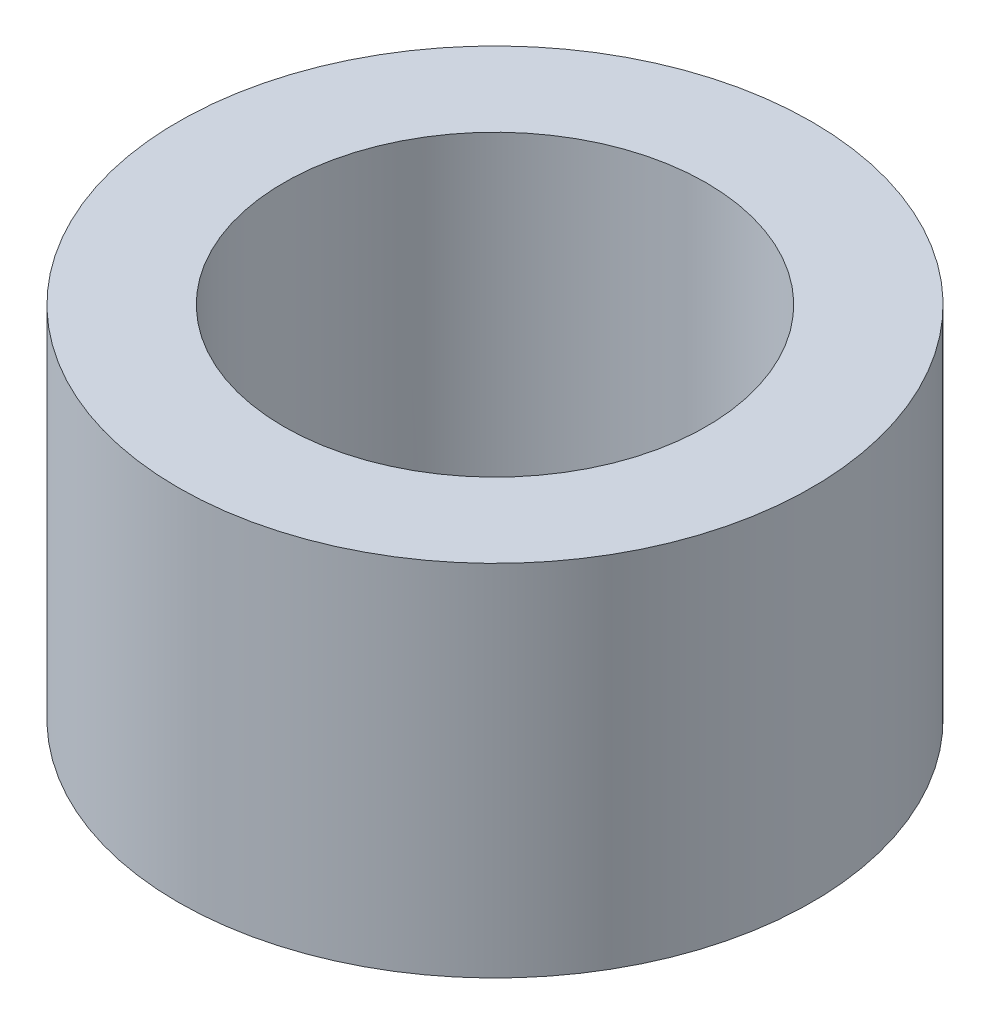
ISO-10303-21;
HEADER;
FILE_DESCRIPTION(('STEP AP214'),'2;1');
FILE_NAME('part.step','',(''),(''),'','','');
FILE_SCHEMA(('AUTOMOTIVE_DESIGN { 1 0 10303 214 1 1 1 1 }'));
ENDSEC;
DATA;
#1=APPLICATION_CONTEXT('core data for automotive mechanical design processes');
#2=APPLICATION_PROTOCOL_DEFINITION('international standard','automotive_design',2000,#1);
#3=PRODUCT_CONTEXT('',#1,'mechanical');
#4=PRODUCT('Part','Part','',(#3));
#5=PRODUCT_RELATED_PRODUCT_CATEGORY('part','',(#4));
#6=PRODUCT_DEFINITION_FORMATION('','',#4);
#7=PRODUCT_DEFINITION_CONTEXT('part definition',#1,'design');
#8=PRODUCT_DEFINITION('design','',#6,#7);
#9=PRODUCT_DEFINITION_SHAPE('','',#8);
#10=(LENGTH_UNIT() NAMED_UNIT(*) SI_UNIT(.MILLI.,.METRE.));
#11=(NAMED_UNIT(*) PLANE_ANGLE_UNIT() SI_UNIT($,.RADIAN.));
#12=(NAMED_UNIT(*) SI_UNIT($,.STERADIAN.) SOLID_ANGLE_UNIT());
#13=UNCERTAINTY_MEASURE_WITH_UNIT(LENGTH_MEASURE(1.E-05),#10,'distance_accuracy_value','');
#14=(GEOMETRIC_REPRESENTATION_CONTEXT(3) GLOBAL_UNCERTAINTY_ASSIGNED_CONTEXT((#13)) GLOBAL_UNIT_ASSIGNED_CONTEXT((#10,
#11,#12)) REPRESENTATION_CONTEXT('',''));
#15=CARTESIAN_POINT('',(0.,0.,0.));
#16=DIRECTION('',(0.,0.,1.));
#17=DIRECTION('',(1.,0.,0.));
#18=AXIS2_PLACEMENT_3D('',#15,#16,#17);
#19=CARTESIAN_POINT('',(0.,0.,0.));
#20=DIRECTION('',(0.,1.,0.));
#21=DIRECTION('',(0.,0.,1.));
#22=AXIS2_PLACEMENT_3D('',#19,#20,#21);
#23=PLANE('',#22);
#24=CARTESIAN_POINT('',(0.,0.,0.));
#25=DIRECTION('',(0.,1.,0.));
#26=DIRECTION('',(0.,0.,1.));
#27=AXIS2_PLACEMENT_3D('',#24,#25,#26);
#28=CIRCLE('',#27,15.);
#29=CARTESIAN_POINT('',(0.,0.,15.));
#30=VERTEX_POINT('',#29);
#31=EDGE_CURVE('E42',#30,#30,#28,.T.);
#32=ORIENTED_EDGE('',*,*,#31,.F.);
#33=EDGE_LOOP('',(#32));
#34=FACE_BOUND('',#33,.T.);
#35=CARTESIAN_POINT('',(0.,0.,0.));
#36=DIRECTION('',(0.,1.,0.));
#37=DIRECTION('',(0.,0.,1.));
#38=AXIS2_PLACEMENT_3D('',#35,#36,#37);
#39=CIRCLE('',#38,10.95);
#40=CARTESIAN_POINT('',(0.,0.,10.95));
#41=VERTEX_POINT('',#40);
#42=EDGE_CURVE('E10',#41,#41,#39,.F.);
#43=ORIENTED_EDGE('',*,*,#42,.F.);
#44=EDGE_LOOP('',(#43));
#45=FACE_BOUND('',#44,.T.);
#46=ADVANCED_FACE('F31',(#34,#45),#23,.F.);
#47=CARTESIAN_POINT('',(0.,17.,0.));
#48=DIRECTION('',(0.,1.,0.));
#49=DIRECTION('',(0.,0.,1.));
#50=AXIS2_PLACEMENT_3D('',#47,#48,#49);
#51=PLANE('',#50);
#52=CARTESIAN_POINT('',(0.,17.,0.));
#53=DIRECTION('',(0.,1.,0.));
#54=DIRECTION('',(0.,0.,1.));
#55=AXIS2_PLACEMENT_3D('',#52,#53,#54);
#56=CIRCLE('',#55,15.);
#57=CARTESIAN_POINT('',(0.,17.,15.));
#58=VERTEX_POINT('',#57);
#59=EDGE_CURVE('E38',#58,#58,#56,.T.);
#60=ORIENTED_EDGE('',*,*,#59,.T.);
#61=EDGE_LOOP('',(#60));
#62=FACE_BOUND('',#61,.T.);
#63=CARTESIAN_POINT('',(0.,17.,0.));
#64=DIRECTION('',(0.,1.,0.));
#65=DIRECTION('',(0.,0.,1.));
#66=AXIS2_PLACEMENT_3D('',#63,#64,#65);
#67=CIRCLE('',#66,10.);
#68=CARTESIAN_POINT('',(0.,17.,10.));
#69=VERTEX_POINT('',#68);
#70=EDGE_CURVE('E47',#69,#69,#67,.T.);
#71=ORIENTED_EDGE('',*,*,#70,.F.);
#72=EDGE_LOOP('',(#71));
#73=FACE_BOUND('',#72,.T.);
#74=ADVANCED_FACE('F74',(#62,#73),#51,.T.);
#75=CARTESIAN_POINT('',(0.,17.,0.));
#76=DIRECTION('',(0.,-1.,0.));
#77=DIRECTION('',(0.,0.,-1.));
#78=AXIS2_PLACEMENT_3D('',#75,#76,#77);
#79=CYLINDRICAL_SURFACE('',#78,15.);
#80=ORIENTED_EDGE('',*,*,#59,.F.);
#81=EDGE_LOOP('',(#80));
#82=FACE_BOUND('',#81,.T.);
#83=ORIENTED_EDGE('',*,*,#31,.T.);
#84=EDGE_LOOP('',(#83));
#85=FACE_BOUND('',#84,.T.);
#86=ADVANCED_FACE('F33',(#82,#85),#79,.T.);
#87=CARTESIAN_POINT('',(0.,17.,0.));
#88=DIRECTION('',(0.,-1.,0.));
#89=DIRECTION('',(0.,0.,-1.));
#90=AXIS2_PLACEMENT_3D('',#87,#88,#89);
#91=CYLINDRICAL_SURFACE('',#90,10.);
#92=ORIENTED_EDGE('',*,*,#70,.T.);
#93=EDGE_LOOP('',(#92));
#94=FACE_BOUND('',#93,.T.);
#95=CARTESIAN_POINT('',(0.,-2.5,0.));
#96=DIRECTION('',(0.,-1.,0.));
#97=DIRECTION('',(0.,0.,-1.));
#98=AXIS2_PLACEMENT_3D('',#95,#96,#97);
#99=CIRCLE('',#98,10.);
#100=CARTESIAN_POINT('',(0.,-2.5,-10.));
#101=VERTEX_POINT('',#100);
#102=EDGE_CURVE('E54',#101,#101,#99,.T.);
#103=ORIENTED_EDGE('',*,*,#102,.T.);
#104=EDGE_LOOP('',(#103));
#105=FACE_BOUND('',#104,.T.);
#106=ADVANCED_FACE('F58',(#94,#105),#91,.F.);
#107=CARTESIAN_POINT('',(0.,-2.5,0.));
#108=DIRECTION('',(0.,-1.,0.));
#109=DIRECTION('',(0.,0.,-1.));
#110=AXIS2_PLACEMENT_3D('',#107,#108,#109);
#111=PLANE('',#110);
#112=CARTESIAN_POINT('',(0.,-2.5,0.));
#113=DIRECTION('',(0.,-1.,0.));
#114=DIRECTION('',(0.,0.,-1.));
#115=AXIS2_PLACEMENT_3D('',#112,#113,#114);
#116=CIRCLE('',#115,10.95);
#117=CARTESIAN_POINT('',(0.,-2.5,-10.95));
#118=VERTEX_POINT('',#117);
#119=EDGE_CURVE('E51',#118,#118,#116,.T.);
#120=ORIENTED_EDGE('',*,*,#119,.T.);
#121=EDGE_LOOP('',(#120));
#122=FACE_BOUND('',#121,.T.);
#123=ORIENTED_EDGE('',*,*,#102,.F.);
#124=EDGE_LOOP('',(#123));
#125=FACE_BOUND('',#124,.T.);
#126=ADVANCED_FACE('F60',(#122,#125),#111,.T.);
#127=CARTESIAN_POINT('',(0.,-2.5,0.));
#128=DIRECTION('',(0.,1.,0.));
#129=DIRECTION('',(0.,0.,1.));
#130=AXIS2_PLACEMENT_3D('',#127,#128,#129);
#131=CYLINDRICAL_SURFACE('',#130,10.95);
#132=ORIENTED_EDGE('',*,*,#119,.F.);
#133=EDGE_LOOP('',(#132));
#134=FACE_BOUND('',#133,.T.);
#135=ORIENTED_EDGE('',*,*,#42,.T.);
#136=EDGE_LOOP('',(#135));
#137=FACE_BOUND('',#136,.T.);
#138=ADVANCED_FACE('F62',(#134,#137),#131,.T.);
#139=CLOSED_SHELL('',(#46,#74,#86,#106,#126,#138));
#140=MANIFOLD_SOLID_BREP('B2',#139);
#141=ADVANCED_BREP_SHAPE_REPRESENTATION('',(#18,#140),#14);
#142=SHAPE_DEFINITION_REPRESENTATION(#9,#141);
ENDSEC;
END-ISO-10303-21;
